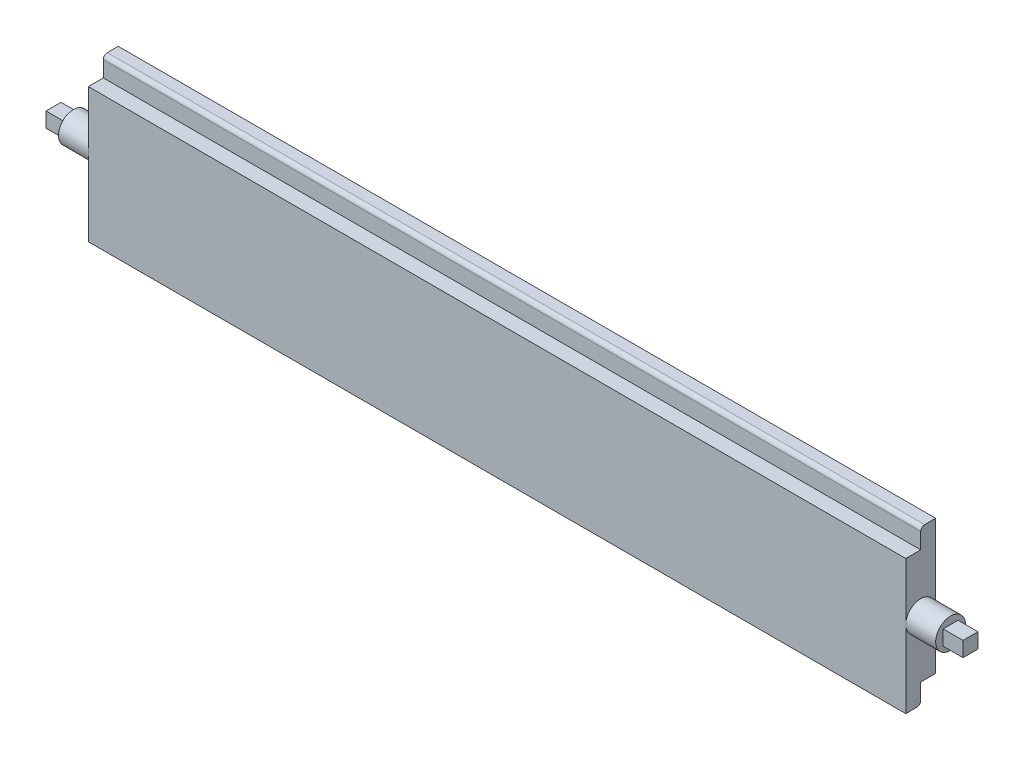
ISO-10303-21;
HEADER;
FILE_DESCRIPTION(('STEP AP214'),'2;1');
FILE_NAME('part.step','',(''),(''),'','','');
FILE_SCHEMA(('AUTOMOTIVE_DESIGN { 1 0 10303 214 1 1 1 1 }'));
ENDSEC;
DATA;
#1=APPLICATION_CONTEXT('core data for automotive mechanical design processes');
#2=APPLICATION_PROTOCOL_DEFINITION('international standard','automotive_design',2000,#1);
#3=PRODUCT_CONTEXT('',#1,'mechanical');
#4=PRODUCT('Part','Part','',(#3));
#5=PRODUCT_RELATED_PRODUCT_CATEGORY('part','',(#4));
#6=PRODUCT_DEFINITION_FORMATION('','',#4);
#7=PRODUCT_DEFINITION_CONTEXT('part definition',#1,'design');
#8=PRODUCT_DEFINITION('design','',#6,#7);
#9=PRODUCT_DEFINITION_SHAPE('','',#8);
#10=(LENGTH_UNIT() NAMED_UNIT(*) SI_UNIT(.MILLI.,.METRE.));
#11=(NAMED_UNIT(*) PLANE_ANGLE_UNIT() SI_UNIT($,.RADIAN.));
#12=(NAMED_UNIT(*) SI_UNIT($,.STERADIAN.) SOLID_ANGLE_UNIT());
#13=UNCERTAINTY_MEASURE_WITH_UNIT(LENGTH_MEASURE(1.E-05),#10,'distance_accuracy_value','');
#14=(GEOMETRIC_REPRESENTATION_CONTEXT(3) GLOBAL_UNCERTAINTY_ASSIGNED_CONTEXT((#13)) GLOBAL_UNIT_ASSIGNED_CONTEXT((#10,
#11,#12)) REPRESENTATION_CONTEXT('',''));
#15=CARTESIAN_POINT('',(0.,0.,0.));
#16=DIRECTION('',(0.,0.,1.));
#17=DIRECTION('',(1.,0.,0.));
#18=AXIS2_PLACEMENT_3D('',#15,#16,#17);
#19=CARTESIAN_POINT('',(-130.302,24.5999,4.7625));
#20=DIRECTION('',(0.,-1.,0.));
#21=DIRECTION('',(0.,0.,-1.));
#22=AXIS2_PLACEMENT_3D('',#19,#20,#21);
#23=PLANE('',#22);
#24=DIRECTION('',(0.,0.,-1.));
#25=VECTOR('',#24,1.);
#26=CARTESIAN_POINT('',(-130.302,24.5999,4.7625));
#27=LINE('',#26,#25);
#28=CARTESIAN_POINT('',(-130.302,24.5999,-1.27));
#29=VERTEX_POINT('',#28);
#30=CARTESIAN_POINT('',(-130.302,24.5999,-4.7625));
#31=VERTEX_POINT('',#30);
#32=EDGE_CURVE('E318',#29,#31,#27,.T.);
#33=ORIENTED_EDGE('',*,*,#32,.F.);
#34=DIRECTION('',(-1.,0.,0.));
#35=VECTOR('',#34,1.);
#36=CARTESIAN_POINT('',(130.302,24.5999,-1.27));
#37=LINE('',#36,#35);
#38=CARTESIAN_POINT('',(130.302,24.5999,-1.27));
#39=VERTEX_POINT('',#38);
#40=EDGE_CURVE('E43',#29,#39,#37,.F.);
#41=ORIENTED_EDGE('',*,*,#40,.T.);
#42=DIRECTION('',(0.,0.,-1.));
#43=VECTOR('',#42,1.);
#44=CARTESIAN_POINT('',(130.302,24.5999,4.7625));
#45=LINE('',#44,#43);
#46=CARTESIAN_POINT('',(130.302,24.5999,-4.7625));
#47=VERTEX_POINT('',#46);
#48=EDGE_CURVE('E320',#39,#47,#45,.T.);
#49=ORIENTED_EDGE('',*,*,#48,.T.);
#50=DIRECTION('',(-1.,0.,0.));
#51=VECTOR('',#50,1.);
#52=CARTESIAN_POINT('',(-130.302,24.5999,-4.7625));
#53=LINE('',#52,#51);
#54=EDGE_CURVE('E307',#47,#31,#53,.T.);
#55=ORIENTED_EDGE('',*,*,#54,.T.);
#56=EDGE_LOOP('',(#33,#41,#49,#55));
#57=FACE_BOUND('',#56,.T.);
#58=ADVANCED_FACE('F35',(#57),#23,.F.);
#59=CARTESIAN_POINT('',(-139.827,0.,0.));
#60=DIRECTION('',(-1.,0.,0.));
#61=DIRECTION('',(0.,0.,-1.));
#62=AXIS2_PLACEMENT_3D('',#59,#60,#61);
#63=PLANE('',#62);
#64=CARTESIAN_POINT('',(-139.827,0.,0.));
#65=DIRECTION('',(1.,0.,0.));
#66=DIRECTION('',(0.,0.,-1.));
#67=AXIS2_PLACEMENT_3D('',#64,#65,#66);
#68=CIRCLE('',#67,4.76249999999911);
#69=CARTESIAN_POINT('',(-139.827,0.,-4.76249999999911));
#70=VERTEX_POINT('',#69);
#71=EDGE_CURVE('E248',#70,#70,#68,.T.);
#72=ORIENTED_EDGE('',*,*,#71,.F.);
#73=EDGE_LOOP('',(#72));
#74=FACE_BOUND('',#73,.T.);
#75=DIRECTION('',(0.,0.,-1.));
#76=VECTOR('',#75,1.);
#77=CARTESIAN_POINT('',(-139.827,-2.3876,2.3876));
#78=LINE('',#77,#76);
#79=CARTESIAN_POINT('',(-139.827,-2.3876,2.3876));
#80=VERTEX_POINT('',#79);
#81=CARTESIAN_POINT('',(-139.827,-2.3876,-2.3876));
#82=VERTEX_POINT('',#81);
#83=EDGE_CURVE('E231',#80,#82,#78,.T.);
#84=ORIENTED_EDGE('',*,*,#83,.T.);
#85=DIRECTION('',(0.,1.,0.));
#86=VECTOR('',#85,1.);
#87=CARTESIAN_POINT('',(-139.827,-2.3876,-2.3876));
#88=LINE('',#87,#86);
#89=CARTESIAN_POINT('',(-139.827,2.3876,-2.3876));
#90=VERTEX_POINT('',#89);
#91=EDGE_CURVE('E213',#82,#90,#88,.T.);
#92=ORIENTED_EDGE('',*,*,#91,.T.);
#93=DIRECTION('',(0.,0.,1.));
#94=VECTOR('',#93,1.);
#95=CARTESIAN_POINT('',(-139.827,2.3876,2.3876));
#96=LINE('',#95,#94);
#97=CARTESIAN_POINT('',(-139.827,2.3876,2.3876));
#98=VERTEX_POINT('',#97);
#99=EDGE_CURVE('E219',#90,#98,#96,.T.);
#100=ORIENTED_EDGE('',*,*,#99,.T.);
#101=DIRECTION('',(0.,-1.,0.));
#102=VECTOR('',#101,1.);
#103=CARTESIAN_POINT('',(-139.827,-2.3876,2.3876));
#104=LINE('',#103,#102);
#105=EDGE_CURVE('E234',#98,#80,#104,.T.);
#106=ORIENTED_EDGE('',*,*,#105,.T.);
#107=EDGE_LOOP('',(#84,#92,#100,#106));
#108=FACE_BOUND('',#107,.T.);
#109=ADVANCED_FACE('F363',(#74,#108),#63,.T.);
#110=CARTESIAN_POINT('',(-130.302,-24.5999,4.7625));
#111=DIRECTION('',(1.,0.,0.));
#112=DIRECTION('',(0.,0.,-1.));
#113=AXIS2_PLACEMENT_3D('',#110,#111,#112);
#114=PLANE('',#113);
#115=DIRECTION('',(0.,-1.,0.));
#116=VECTOR('',#115,1.);
#117=CARTESIAN_POINT('',(-130.302,24.5999,0.));
#118=LINE('',#117,#116);
#119=CARTESIAN_POINT('',(-130.302,23.3299,0.));
#120=VERTEX_POINT('',#119);
#121=CARTESIAN_POINT('',(-130.302,18.2499,0.));
#122=VERTEX_POINT('',#121);
#123=EDGE_CURVE('E200',#120,#122,#118,.T.);
#124=ORIENTED_EDGE('',*,*,#123,.F.);
#125=CARTESIAN_POINT('',(-130.302,23.3299,-1.27));
#126=DIRECTION('',(1.,0.,0.));
#127=DIRECTION('',(0.,0.,-1.));
#128=AXIS2_PLACEMENT_3D('',#125,#126,#127);
#129=CIRCLE('',#128,1.27);
#130=EDGE_CURVE('E57',#120,#29,#129,.F.);
#131=ORIENTED_EDGE('',*,*,#130,.T.);
#132=ORIENTED_EDGE('',*,*,#32,.T.);
#133=DIRECTION('',(0.,-1.,0.));
#134=VECTOR('',#133,1.);
#135=CARTESIAN_POINT('',(-130.302,-24.5999,-4.7625));
#136=LINE('',#135,#134);
#137=CARTESIAN_POINT('',(-130.302,0.,-4.7625));
#138=VERTEX_POINT('',#137);
#139=EDGE_CURVE('E310',#31,#138,#136,.T.);
#140=ORIENTED_EDGE('',*,*,#139,.T.);
#141=CARTESIAN_POINT('',(-130.302,0.,0.));
#142=DIRECTION('',(1.,0.,0.));
#143=DIRECTION('',(0.,0.,-1.));
#144=AXIS2_PLACEMENT_3D('',#141,#142,#143);
#145=CIRCLE('',#144,4.76249999999911);
#146=CARTESIAN_POINT('',(-130.302,0.,4.76249999999911));
#147=VERTEX_POINT('',#146);
#148=EDGE_CURVE('E247',#138,#147,#145,.T.);
#149=ORIENTED_EDGE('',*,*,#148,.T.);
#150=DIRECTION('',(0.,-1.,0.));
#151=VECTOR('',#150,1.);
#152=CARTESIAN_POINT('',(-130.302,-24.5999,4.7625));
#153=LINE('',#152,#151);
#154=CARTESIAN_POINT('',(-130.302,18.2499,4.7625));
#155=VERTEX_POINT('',#154);
#156=EDGE_CURVE('E300',#155,#147,#153,.T.);
#157=ORIENTED_EDGE('',*,*,#156,.F.);
#158=DIRECTION('',(0.,0.,1.));
#159=VECTOR('',#158,1.);
#160=CARTESIAN_POINT('',(-130.302,18.2499,0.));
#161=LINE('',#160,#159);
#162=EDGE_CURVE('E208',#122,#155,#161,.T.);
#163=ORIENTED_EDGE('',*,*,#162,.F.);
#164=EDGE_LOOP('',(#124,#131,#132,#140,#149,#157,#163));
#165=FACE_BOUND('',#164,.T.);
#166=ADVANCED_FACE('F340',(#165),#114,.F.);
#167=CARTESIAN_POINT('',(130.302,-24.5999,4.7625));
#168=DIRECTION('',(-1.,0.,0.));
#169=DIRECTION('',(0.,0.,1.));
#170=AXIS2_PLACEMENT_3D('',#167,#168,#169);
#171=PLANE('',#170);
#172=ORIENTED_EDGE('',*,*,#48,.F.);
#173=CARTESIAN_POINT('',(130.302,23.3299,-1.27));
#174=DIRECTION('',(-1.,0.,0.));
#175=DIRECTION('',(0.,0.,1.));
#176=AXIS2_PLACEMENT_3D('',#173,#174,#175);
#177=CIRCLE('',#176,1.27);
#178=CARTESIAN_POINT('',(130.302,23.3299,0.));
#179=VERTEX_POINT('',#178);
#180=EDGE_CURVE('E11',#39,#179,#177,.F.);
#181=ORIENTED_EDGE('',*,*,#180,.T.);
#182=DIRECTION('',(0.,1.,0.));
#183=VECTOR('',#182,1.);
#184=CARTESIAN_POINT('',(130.302,24.5999,0.));
#185=LINE('',#184,#183);
#186=CARTESIAN_POINT('',(130.302,18.2499,0.));
#187=VERTEX_POINT('',#186);
#188=EDGE_CURVE('E205',#187,#179,#185,.T.);
#189=ORIENTED_EDGE('',*,*,#188,.F.);
#190=DIRECTION('',(0.,0.,1.));
#191=VECTOR('',#190,1.);
#192=CARTESIAN_POINT('',(130.302,18.2499,0.));
#193=LINE('',#192,#191);
#194=CARTESIAN_POINT('',(130.302,18.2499,4.7625));
#195=VERTEX_POINT('',#194);
#196=EDGE_CURVE('E210',#187,#195,#193,.T.);
#197=ORIENTED_EDGE('',*,*,#196,.T.);
#198=DIRECTION('',(0.,1.,0.));
#199=VECTOR('',#198,1.);
#200=CARTESIAN_POINT('',(130.302,-24.5999,4.7625));
#201=LINE('',#200,#199);
#202=CARTESIAN_POINT('',(130.302,0.,4.7625));
#203=VERTEX_POINT('',#202);
#204=EDGE_CURVE('E299',#203,#195,#201,.T.);
#205=ORIENTED_EDGE('',*,*,#204,.F.);
#206=CARTESIAN_POINT('',(130.302,0.,0.));
#207=DIRECTION('',(1.,0.,0.));
#208=DIRECTION('',(0.,0.,-1.));
#209=AXIS2_PLACEMENT_3D('',#206,#207,#208);
#210=CIRCLE('',#209,4.76249999999911);
#211=CARTESIAN_POINT('',(130.302,0.,-4.76249999999911));
#212=VERTEX_POINT('',#211);
#213=EDGE_CURVE('E287',#212,#203,#210,.T.);
#214=ORIENTED_EDGE('',*,*,#213,.F.);
#215=DIRECTION('',(0.,1.,0.));
#216=VECTOR('',#215,1.);
#217=CARTESIAN_POINT('',(130.302,-24.5999,-4.7625));
#218=LINE('',#217,#216);
#219=EDGE_CURVE('E291',#212,#47,#218,.T.);
#220=ORIENTED_EDGE('',*,*,#219,.T.);
#221=EDGE_LOOP('',(#172,#181,#189,#197,#205,#214,#220));
#222=FACE_BOUND('',#221,.T.);
#223=ADVANCED_FACE('F353',(#222),#171,.F.);
#224=DIRECTION('',(0.,0.,-1.));
#225=VECTOR('',#224,1.);
#226=CARTESIAN_POINT('',(130.302,-24.5999,4.7625));
#227=LINE('',#226,#225);
#228=CARTESIAN_POINT('',(130.302,-24.5999,4.7625));
#229=VERTEX_POINT('',#228);
#230=CARTESIAN_POINT('',(130.302,-24.5999,1.27));
#231=VERTEX_POINT('',#230);
#232=EDGE_CURVE('E304',#229,#231,#227,.T.);
#233=ORIENTED_EDGE('',*,*,#232,.T.);
#234=CARTESIAN_POINT('',(130.302,-23.3299,1.27));
#235=DIRECTION('',(-1.,0.,0.));
#236=DIRECTION('',(0.,0.,1.));
#237=AXIS2_PLACEMENT_3D('',#234,#235,#236);
#238=CIRCLE('',#237,1.27);
#239=CARTESIAN_POINT('',(130.302,-23.3299,0.));
#240=VERTEX_POINT('',#239);
#241=EDGE_CURVE('E327',#231,#240,#238,.F.);
#242=ORIENTED_EDGE('',*,*,#241,.T.);
#243=DIRECTION('',(0.,-1.,0.));
#244=VECTOR('',#243,1.);
#245=CARTESIAN_POINT('',(130.302,-24.5999,0.));
#246=LINE('',#245,#244);
#247=CARTESIAN_POINT('',(130.302,-18.2499,0.));
#248=VERTEX_POINT('',#247);
#249=EDGE_CURVE('E181',#248,#240,#246,.T.);
#250=ORIENTED_EDGE('',*,*,#249,.F.);
#251=DIRECTION('',(0.,0.,-1.));
#252=VECTOR('',#251,1.);
#253=CARTESIAN_POINT('',(130.302,-18.2499,0.));
#254=LINE('',#253,#252);
#255=CARTESIAN_POINT('',(130.302,-18.2499,-4.7625));
#256=VERTEX_POINT('',#255);
#257=EDGE_CURVE('E188',#248,#256,#254,.T.);
#258=ORIENTED_EDGE('',*,*,#257,.T.);
#259=EDGE_CURVE('E305',#256,#212,#218,.T.);
#260=ORIENTED_EDGE('',*,*,#259,.T.);
#261=EDGE_CURVE('E294',#203,#212,#210,.T.);
#262=ORIENTED_EDGE('',*,*,#261,.F.);
#263=EDGE_CURVE('E295',#229,#203,#201,.T.);
#264=ORIENTED_EDGE('',*,*,#263,.F.);
#265=EDGE_LOOP('',(#233,#242,#250,#258,#260,#262,#264));
#266=FACE_BOUND('',#265,.T.);
#267=ADVANCED_FACE('F373',(#266),#171,.F.);
#268=DIRECTION('',(0.,1.,0.));
#269=VECTOR('',#268,1.);
#270=CARTESIAN_POINT('',(-130.302,-24.5999,0.));
#271=LINE('',#270,#269);
#272=CARTESIAN_POINT('',(-130.302,-23.3299,0.));
#273=VERTEX_POINT('',#272);
#274=CARTESIAN_POINT('',(-130.302,-18.2499,0.));
#275=VERTEX_POINT('',#274);
#276=EDGE_CURVE('E171',#273,#275,#271,.T.);
#277=ORIENTED_EDGE('',*,*,#276,.F.);
#278=CARTESIAN_POINT('',(-130.302,-23.3299,1.27));
#279=DIRECTION('',(1.,0.,0.));
#280=DIRECTION('',(0.,0.,-1.));
#281=AXIS2_PLACEMENT_3D('',#278,#279,#280);
#282=CIRCLE('',#281,1.27);
#283=CARTESIAN_POINT('',(-130.302,-24.5999,1.27));
#284=VERTEX_POINT('',#283);
#285=EDGE_CURVE('E323',#273,#284,#282,.F.);
#286=ORIENTED_EDGE('',*,*,#285,.T.);
#287=DIRECTION('',(0.,0.,-1.));
#288=VECTOR('',#287,1.);
#289=CARTESIAN_POINT('',(-130.302,-24.5999,4.7625));
#290=LINE('',#289,#288);
#291=CARTESIAN_POINT('',(-130.302,-24.5999,4.7625));
#292=VERTEX_POINT('',#291);
#293=EDGE_CURVE('E315',#292,#284,#290,.T.);
#294=ORIENTED_EDGE('',*,*,#293,.F.);
#295=EDGE_CURVE('E298',#147,#292,#153,.T.);
#296=ORIENTED_EDGE('',*,*,#295,.F.);
#297=EDGE_CURVE('E254',#147,#138,#145,.T.);
#298=ORIENTED_EDGE('',*,*,#297,.T.);
#299=CARTESIAN_POINT('',(-130.302,-18.2499,-4.7625));
#300=VERTEX_POINT('',#299);
#301=EDGE_CURVE('E194',#138,#300,#136,.T.);
#302=ORIENTED_EDGE('',*,*,#301,.T.);
#303=DIRECTION('',(0.,0.,-1.));
#304=VECTOR('',#303,1.);
#305=CARTESIAN_POINT('',(-130.302,-18.2499,0.));
#306=LINE('',#305,#304);
#307=EDGE_CURVE('E185',#275,#300,#306,.T.);
#308=ORIENTED_EDGE('',*,*,#307,.F.);
#309=EDGE_LOOP('',(#277,#286,#294,#296,#298,#302,#308));
#310=FACE_BOUND('',#309,.T.);
#311=ADVANCED_FACE('F191',(#310),#114,.F.);
#312=CARTESIAN_POINT('',(-130.302,-24.5999,4.7625));
#313=DIRECTION('',(0.,1.,0.));
#314=DIRECTION('',(0.,0.,1.));
#315=AXIS2_PLACEMENT_3D('',#312,#313,#314);
#316=PLANE('',#315);
#317=ORIENTED_EDGE('',*,*,#293,.T.);
#318=DIRECTION('',(-1.,0.,0.));
#319=VECTOR('',#318,1.);
#320=CARTESIAN_POINT('',(-130.302,-24.5999,1.27));
#321=LINE('',#320,#319);
#322=EDGE_CURVE('E325',#284,#231,#321,.F.);
#323=ORIENTED_EDGE('',*,*,#322,.T.);
#324=ORIENTED_EDGE('',*,*,#232,.F.);
#325=DIRECTION('',(1.,0.,0.));
#326=VECTOR('',#325,1.);
#327=CARTESIAN_POINT('',(-130.302,-24.5999,4.7625));
#328=LINE('',#327,#326);
#329=EDGE_CURVE('E302',#292,#229,#328,.T.);
#330=ORIENTED_EDGE('',*,*,#329,.F.);
#331=EDGE_LOOP('',(#317,#323,#324,#330));
#332=FACE_BOUND('',#331,.T.);
#333=ADVANCED_FACE('F380',(#332),#316,.F.);
#334=CARTESIAN_POINT('',(0.,0.,4.7625));
#335=DIRECTION('',(0.,0.,-1.));
#336=DIRECTION('',(-1.,0.,0.));
#337=AXIS2_PLACEMENT_3D('',#334,#335,#336);
#338=PLANE('',#337);
#339=ORIENTED_EDGE('',*,*,#204,.T.);
#340=DIRECTION('',(1.,0.,0.));
#341=VECTOR('',#340,1.);
#342=CARTESIAN_POINT('',(-130.302,18.2499,4.7625));
#343=LINE('',#342,#341);
#344=EDGE_CURVE('E196',#155,#195,#343,.T.);
#345=ORIENTED_EDGE('',*,*,#344,.F.);
#346=ORIENTED_EDGE('',*,*,#156,.T.);
#347=ORIENTED_EDGE('',*,*,#295,.T.);
#348=ORIENTED_EDGE('',*,*,#329,.T.);
#349=ORIENTED_EDGE('',*,*,#263,.T.);
#350=EDGE_LOOP('',(#339,#345,#346,#347,#348,#349));
#351=FACE_BOUND('',#350,.T.);
#352=ADVANCED_FACE('F347',(#351),#338,.F.);
#353=CARTESIAN_POINT('',(0.,0.,-4.7625));
#354=DIRECTION('',(0.,0.,-1.));
#355=DIRECTION('',(-1.,0.,0.));
#356=AXIS2_PLACEMENT_3D('',#353,#354,#355);
#357=PLANE('',#356);
#358=DIRECTION('',(1.,0.,0.));
#359=VECTOR('',#358,1.);
#360=CARTESIAN_POINT('',(130.302,-18.2499,-4.7625));
#361=LINE('',#360,#359);
#362=EDGE_CURVE('E394',#300,#256,#361,.T.);
#363=ORIENTED_EDGE('',*,*,#362,.F.);
#364=ORIENTED_EDGE('',*,*,#301,.F.);
#365=ORIENTED_EDGE('',*,*,#139,.F.);
#366=ORIENTED_EDGE('',*,*,#54,.F.);
#367=ORIENTED_EDGE('',*,*,#219,.F.);
#368=ORIENTED_EDGE('',*,*,#259,.F.);
#369=EDGE_LOOP('',(#363,#364,#365,#366,#367,#368));
#370=FACE_BOUND('',#369,.T.);
#371=ADVANCED_FACE('F391',(#370),#357,.T.);
#372=CARTESIAN_POINT('',(139.827,0.,0.));
#373=DIRECTION('',(-1.,0.,0.));
#374=DIRECTION('',(0.,0.,1.));
#375=AXIS2_PLACEMENT_3D('',#372,#373,#374);
#376=CYLINDRICAL_SURFACE('',#375,4.76249999999911);
#377=CARTESIAN_POINT('',(139.827,0.,0.));
#378=DIRECTION('',(1.,0.,0.));
#379=DIRECTION('',(0.,0.,-1.));
#380=AXIS2_PLACEMENT_3D('',#377,#378,#379);
#381=CIRCLE('',#380,4.76249999999911);
#382=CARTESIAN_POINT('',(139.827,0.,-4.76249999999911));
#383=VERTEX_POINT('',#382);
#384=EDGE_CURVE('E288',#383,#383,#381,.T.);
#385=ORIENTED_EDGE('',*,*,#384,.F.);
#386=EDGE_LOOP('',(#385));
#387=FACE_BOUND('',#386,.T.);
#388=ORIENTED_EDGE('',*,*,#213,.T.);
#389=ORIENTED_EDGE('',*,*,#261,.T.);
#390=EDGE_LOOP('',(#388,#389));
#391=FACE_BOUND('',#390,.T.);
#392=ADVANCED_FACE('F398',(#387,#391),#376,.T.);
#393=CARTESIAN_POINT('',(139.827,0.,0.));
#394=DIRECTION('',(1.,0.,0.));
#395=DIRECTION('',(0.,0.,-1.));
#396=AXIS2_PLACEMENT_3D('',#393,#394,#395);
#397=PLANE('',#396);
#398=DIRECTION('',(0.,1.,0.));
#399=VECTOR('',#398,1.);
#400=CARTESIAN_POINT('',(139.827,-2.3876,-2.3876));
#401=LINE('',#400,#399);
#402=CARTESIAN_POINT('',(139.827,-2.3876,-2.3876));
#403=VERTEX_POINT('',#402);
#404=CARTESIAN_POINT('',(139.827,2.3876,-2.3876));
#405=VERTEX_POINT('',#404);
#406=EDGE_CURVE('E251',#403,#405,#401,.T.);
#407=ORIENTED_EDGE('',*,*,#406,.F.);
#408=DIRECTION('',(0.,0.,-1.));
#409=VECTOR('',#408,1.);
#410=CARTESIAN_POINT('',(139.827,-2.3876,2.3876));
#411=LINE('',#410,#409);
#412=CARTESIAN_POINT('',(139.827,-2.3876,2.3876));
#413=VERTEX_POINT('',#412);
#414=EDGE_CURVE('E259',#413,#403,#411,.T.);
#415=ORIENTED_EDGE('',*,*,#414,.F.);
#416=DIRECTION('',(0.,-1.,0.));
#417=VECTOR('',#416,1.);
#418=CARTESIAN_POINT('',(139.827,-2.3876,2.3876));
#419=LINE('',#418,#417);
#420=CARTESIAN_POINT('',(139.827,2.3876,2.3876));
#421=VERTEX_POINT('',#420);
#422=EDGE_CURVE('E271',#421,#413,#419,.T.);
#423=ORIENTED_EDGE('',*,*,#422,.F.);
#424=DIRECTION('',(0.,0.,1.));
#425=VECTOR('',#424,1.);
#426=CARTESIAN_POINT('',(139.827,2.3876,2.3876));
#427=LINE('',#426,#425);
#428=EDGE_CURVE('E268',#405,#421,#427,.T.);
#429=ORIENTED_EDGE('',*,*,#428,.F.);
#430=EDGE_LOOP('',(#407,#415,#423,#429));
#431=FACE_BOUND('',#430,.T.);
#432=ORIENTED_EDGE('',*,*,#384,.T.);
#433=EDGE_LOOP('',(#432));
#434=FACE_BOUND('',#433,.T.);
#435=ADVANCED_FACE('F400',(#431,#434),#397,.T.);
#436=CARTESIAN_POINT('',(146.177,-2.3876,-2.3876));
#437=DIRECTION('',(0.,0.,1.));
#438=DIRECTION('',(1.,0.,0.));
#439=AXIS2_PLACEMENT_3D('',#436,#437,#438);
#440=PLANE('',#439);
#441=ORIENTED_EDGE('',*,*,#406,.T.);
#442=DIRECTION('',(-1.,0.,0.));
#443=VECTOR('',#442,1.);
#444=CARTESIAN_POINT('',(146.177,2.3876,-2.3876));
#445=LINE('',#444,#443);
#446=CARTESIAN_POINT('',(146.177,2.3876,-2.3876));
#447=VERTEX_POINT('',#446);
#448=EDGE_CURVE('E284',#447,#405,#445,.T.);
#449=ORIENTED_EDGE('',*,*,#448,.F.);
#450=DIRECTION('',(0.,1.,0.));
#451=VECTOR('',#450,1.);
#452=CARTESIAN_POINT('',(146.177,-2.3876,-2.3876));
#453=LINE('',#452,#451);
#454=CARTESIAN_POINT('',(146.177,-2.3876,-2.3876));
#455=VERTEX_POINT('',#454);
#456=EDGE_CURVE('E255',#455,#447,#453,.T.);
#457=ORIENTED_EDGE('',*,*,#456,.F.);
#458=DIRECTION('',(-1.,0.,0.));
#459=VECTOR('',#458,1.);
#460=CARTESIAN_POINT('',(146.177,-2.3876,-2.3876));
#461=LINE('',#460,#459);
#462=EDGE_CURVE('E265',#455,#403,#461,.T.);
#463=ORIENTED_EDGE('',*,*,#462,.T.);
#464=EDGE_LOOP('',(#441,#449,#457,#463));
#465=FACE_BOUND('',#464,.T.);
#466=ADVANCED_FACE('F407',(#465),#440,.F.);
#467=CARTESIAN_POINT('',(146.177,2.3876,2.3876));
#468=DIRECTION('',(0.,-1.,0.));
#469=DIRECTION('',(0.,0.,-1.));
#470=AXIS2_PLACEMENT_3D('',#467,#468,#469);
#471=PLANE('',#470);
#472=ORIENTED_EDGE('',*,*,#428,.T.);
#473=DIRECTION('',(-1.,0.,0.));
#474=VECTOR('',#473,1.);
#475=CARTESIAN_POINT('',(146.177,2.3876,2.3876));
#476=LINE('',#475,#474);
#477=CARTESIAN_POINT('',(146.177,2.3876,2.3876));
#478=VERTEX_POINT('',#477);
#479=EDGE_CURVE('E281',#478,#421,#476,.T.);
#480=ORIENTED_EDGE('',*,*,#479,.F.);
#481=DIRECTION('',(0.,0.,1.));
#482=VECTOR('',#481,1.);
#483=CARTESIAN_POINT('',(146.177,2.3876,2.3876));
#484=LINE('',#483,#482);
#485=EDGE_CURVE('E258',#447,#478,#484,.T.);
#486=ORIENTED_EDGE('',*,*,#485,.F.);
#487=ORIENTED_EDGE('',*,*,#448,.T.);
#488=EDGE_LOOP('',(#472,#480,#486,#487));
#489=FACE_BOUND('',#488,.T.);
#490=ADVANCED_FACE('F497',(#489),#471,.F.);
#491=CARTESIAN_POINT('',(146.177,-2.3876,2.3876));
#492=DIRECTION('',(0.,0.,-1.));
#493=DIRECTION('',(-1.,0.,0.));
#494=AXIS2_PLACEMENT_3D('',#491,#492,#493);
#495=PLANE('',#494);
#496=ORIENTED_EDGE('',*,*,#422,.T.);
#497=DIRECTION('',(-1.,0.,0.));
#498=VECTOR('',#497,1.);
#499=CARTESIAN_POINT('',(146.177,-2.3876,2.3876));
#500=LINE('',#499,#498);
#501=CARTESIAN_POINT('',(146.177,-2.3876,2.3876));
#502=VERTEX_POINT('',#501);
#503=EDGE_CURVE('E278',#502,#413,#500,.T.);
#504=ORIENTED_EDGE('',*,*,#503,.F.);
#505=DIRECTION('',(0.,-1.,0.));
#506=VECTOR('',#505,1.);
#507=CARTESIAN_POINT('',(146.177,-2.3876,2.3876));
#508=LINE('',#507,#506);
#509=EDGE_CURVE('E261',#478,#502,#508,.T.);
#510=ORIENTED_EDGE('',*,*,#509,.F.);
#511=ORIENTED_EDGE('',*,*,#479,.T.);
#512=EDGE_LOOP('',(#496,#504,#510,#511));
#513=FACE_BOUND('',#512,.T.);
#514=ADVANCED_FACE('F505',(#513),#495,.F.);
#515=CARTESIAN_POINT('',(146.177,-2.3876,2.3876));
#516=DIRECTION('',(0.,1.,0.));
#517=DIRECTION('',(0.,0.,1.));
#518=AXIS2_PLACEMENT_3D('',#515,#516,#517);
#519=PLANE('',#518);
#520=ORIENTED_EDGE('',*,*,#414,.T.);
#521=ORIENTED_EDGE('',*,*,#462,.F.);
#522=DIRECTION('',(0.,0.,-1.));
#523=VECTOR('',#522,1.);
#524=CARTESIAN_POINT('',(146.177,-2.3876,2.3876));
#525=LINE('',#524,#523);
#526=EDGE_CURVE('E263',#502,#455,#525,.T.);
#527=ORIENTED_EDGE('',*,*,#526,.F.);
#528=ORIENTED_EDGE('',*,*,#503,.T.);
#529=EDGE_LOOP('',(#520,#521,#527,#528));
#530=FACE_BOUND('',#529,.T.);
#531=ADVANCED_FACE('F514',(#530),#519,.F.);
#532=CARTESIAN_POINT('',(146.177,0.,0.));
#533=DIRECTION('',(-1.,0.,0.));
#534=DIRECTION('',(0.,0.,1.));
#535=AXIS2_PLACEMENT_3D('',#532,#533,#534);
#536=PLANE('',#535);
#537=ORIENTED_EDGE('',*,*,#456,.T.);
#538=ORIENTED_EDGE('',*,*,#485,.T.);
#539=ORIENTED_EDGE('',*,*,#509,.T.);
#540=ORIENTED_EDGE('',*,*,#526,.T.);
#541=EDGE_LOOP('',(#537,#538,#539,#540));
#542=FACE_BOUND('',#541,.T.);
#543=ADVANCED_FACE('F522',(#542),#536,.F.);
#544=CARTESIAN_POINT('',(-139.827,0.,0.));
#545=DIRECTION('',(1.,0.,0.));
#546=DIRECTION('',(0.,0.,-1.));
#547=AXIS2_PLACEMENT_3D('',#544,#545,#546);
#548=CYLINDRICAL_SURFACE('',#547,4.76249999999911);
#549=ORIENTED_EDGE('',*,*,#71,.T.);
#550=EDGE_LOOP('',(#549));
#551=FACE_BOUND('',#550,.T.);
#552=ORIENTED_EDGE('',*,*,#148,.F.);
#553=ORIENTED_EDGE('',*,*,#297,.F.);
#554=EDGE_LOOP('',(#552,#553));
#555=FACE_BOUND('',#554,.T.);
#556=ADVANCED_FACE('F530',(#551,#555),#548,.T.);
#557=CARTESIAN_POINT('',(-146.177,-2.3876,-2.3876));
#558=DIRECTION('',(0.,0.,-1.));
#559=DIRECTION('',(-1.,0.,0.));
#560=AXIS2_PLACEMENT_3D('',#557,#558,#559);
#561=PLANE('',#560);
#562=ORIENTED_EDGE('',*,*,#91,.F.);
#563=DIRECTION('',(1.,0.,0.));
#564=VECTOR('',#563,1.);
#565=CARTESIAN_POINT('',(-146.177,-2.3876,-2.3876));
#566=LINE('',#565,#564);
#567=CARTESIAN_POINT('',(-146.177,-2.3876,-2.3876));
#568=VERTEX_POINT('',#567);
#569=EDGE_CURVE('E244',#568,#82,#566,.T.);
#570=ORIENTED_EDGE('',*,*,#569,.F.);
#571=DIRECTION('',(0.,1.,0.));
#572=VECTOR('',#571,1.);
#573=CARTESIAN_POINT('',(-146.177,-2.3876,-2.3876));
#574=LINE('',#573,#572);
#575=CARTESIAN_POINT('',(-146.177,2.3876,-2.3876));
#576=VERTEX_POINT('',#575);
#577=EDGE_CURVE('E215',#568,#576,#574,.T.);
#578=ORIENTED_EDGE('',*,*,#577,.T.);
#579=DIRECTION('',(1.,0.,0.));
#580=VECTOR('',#579,1.);
#581=CARTESIAN_POINT('',(-146.177,2.3876,-2.3876));
#582=LINE('',#581,#580);
#583=EDGE_CURVE('E228',#576,#90,#582,.T.);
#584=ORIENTED_EDGE('',*,*,#583,.T.);
#585=EDGE_LOOP('',(#562,#570,#578,#584));
#586=FACE_BOUND('',#585,.T.);
#587=ADVANCED_FACE('F546',(#586),#561,.T.);
#588=CARTESIAN_POINT('',(-146.177,-2.3876,2.3876));
#589=DIRECTION('',(0.,-1.,0.));
#590=DIRECTION('',(0.,0.,-1.));
#591=AXIS2_PLACEMENT_3D('',#588,#589,#590);
#592=PLANE('',#591);
#593=ORIENTED_EDGE('',*,*,#83,.F.);
#594=DIRECTION('',(1.,0.,0.));
#595=VECTOR('',#594,1.);
#596=CARTESIAN_POINT('',(-146.177,-2.3876,2.3876));
#597=LINE('',#596,#595);
#598=CARTESIAN_POINT('',(-146.177,-2.3876,2.3876));
#599=VERTEX_POINT('',#598);
#600=EDGE_CURVE('E242',#599,#80,#597,.T.);
#601=ORIENTED_EDGE('',*,*,#600,.F.);
#602=DIRECTION('',(0.,0.,-1.));
#603=VECTOR('',#602,1.);
#604=CARTESIAN_POINT('',(-146.177,-2.3876,2.3876));
#605=LINE('',#604,#603);
#606=EDGE_CURVE('E218',#599,#568,#605,.T.);
#607=ORIENTED_EDGE('',*,*,#606,.T.);
#608=ORIENTED_EDGE('',*,*,#569,.T.);
#609=EDGE_LOOP('',(#593,#601,#607,#608));
#610=FACE_BOUND('',#609,.T.);
#611=ADVANCED_FACE('F555',(#610),#592,.T.);
#612=CARTESIAN_POINT('',(-146.177,-2.3876,2.3876));
#613=DIRECTION('',(0.,0.,1.));
#614=DIRECTION('',(1.,0.,0.));
#615=AXIS2_PLACEMENT_3D('',#612,#613,#614);
#616=PLANE('',#615);
#617=ORIENTED_EDGE('',*,*,#105,.F.);
#618=DIRECTION('',(1.,0.,0.));
#619=VECTOR('',#618,1.);
#620=CARTESIAN_POINT('',(-146.177,2.3876,2.3876));
#621=LINE('',#620,#619);
#622=CARTESIAN_POINT('',(-146.177,2.3876,2.3876));
#623=VERTEX_POINT('',#622);
#624=EDGE_CURVE('E240',#623,#98,#621,.T.);
#625=ORIENTED_EDGE('',*,*,#624,.F.);
#626=DIRECTION('',(0.,-1.,0.));
#627=VECTOR('',#626,1.);
#628=CARTESIAN_POINT('',(-146.177,-2.3876,2.3876));
#629=LINE('',#628,#627);
#630=EDGE_CURVE('E222',#623,#599,#629,.T.);
#631=ORIENTED_EDGE('',*,*,#630,.T.);
#632=ORIENTED_EDGE('',*,*,#600,.T.);
#633=EDGE_LOOP('',(#617,#625,#631,#632));
#634=FACE_BOUND('',#633,.T.);
#635=ADVANCED_FACE('F565',(#634),#616,.T.);
#636=CARTESIAN_POINT('',(-146.177,2.3876,2.3876));
#637=DIRECTION('',(0.,1.,0.));
#638=DIRECTION('',(0.,0.,1.));
#639=AXIS2_PLACEMENT_3D('',#636,#637,#638);
#640=PLANE('',#639);
#641=ORIENTED_EDGE('',*,*,#99,.F.);
#642=ORIENTED_EDGE('',*,*,#583,.F.);
#643=DIRECTION('',(0.,0.,1.));
#644=VECTOR('',#643,1.);
#645=CARTESIAN_POINT('',(-146.177,2.3876,2.3876));
#646=LINE('',#645,#644);
#647=EDGE_CURVE('E225',#576,#623,#646,.T.);
#648=ORIENTED_EDGE('',*,*,#647,.T.);
#649=ORIENTED_EDGE('',*,*,#624,.T.);
#650=EDGE_LOOP('',(#641,#642,#648,#649));
#651=FACE_BOUND('',#650,.T.);
#652=ADVANCED_FACE('F575',(#651),#640,.T.);
#653=CARTESIAN_POINT('',(-146.177,0.,0.));
#654=DIRECTION('',(1.,0.,0.));
#655=DIRECTION('',(0.,0.,1.));
#656=AXIS2_PLACEMENT_3D('',#653,#654,#655);
#657=PLANE('',#656);
#658=ORIENTED_EDGE('',*,*,#577,.F.);
#659=ORIENTED_EDGE('',*,*,#606,.F.);
#660=ORIENTED_EDGE('',*,*,#630,.F.);
#661=ORIENTED_EDGE('',*,*,#647,.F.);
#662=EDGE_LOOP('',(#658,#659,#660,#661));
#663=FACE_BOUND('',#662,.T.);
#664=ADVANCED_FACE('F584',(#663),#657,.F.);
#665=CARTESIAN_POINT('',(-130.302,18.2499,0.));
#666=DIRECTION('',(0.,-1.,0.));
#667=DIRECTION('',(0.,0.,-1.));
#668=AXIS2_PLACEMENT_3D('',#665,#666,#667);
#669=PLANE('',#668);
#670=ORIENTED_EDGE('',*,*,#344,.T.);
#671=ORIENTED_EDGE('',*,*,#196,.F.);
#672=DIRECTION('',(1.,0.,0.));
#673=VECTOR('',#672,1.);
#674=CARTESIAN_POINT('',(-130.302,18.2499,0.));
#675=LINE('',#674,#673);
#676=EDGE_CURVE('E202',#122,#187,#675,.T.);
#677=ORIENTED_EDGE('',*,*,#676,.F.);
#678=ORIENTED_EDGE('',*,*,#162,.T.);
#679=EDGE_LOOP('',(#670,#671,#677,#678));
#680=FACE_BOUND('',#679,.T.);
#681=ADVANCED_FACE('F344',(#680),#669,.F.);
#682=CARTESIAN_POINT('',(0.,0.,0.));
#683=DIRECTION('',(0.,0.,1.));
#684=DIRECTION('',(1.,0.,0.));
#685=AXIS2_PLACEMENT_3D('',#682,#683,#684);
#686=PLANE('',#685);
#687=ORIENTED_EDGE('',*,*,#188,.T.);
#688=DIRECTION('',(-1.,0.,0.));
#689=VECTOR('',#688,1.);
#690=CARTESIAN_POINT('',(-130.302,23.3299,0.));
#691=LINE('',#690,#689);
#692=EDGE_CURVE('E329',#179,#120,#691,.T.);
#693=ORIENTED_EDGE('',*,*,#692,.T.);
#694=ORIENTED_EDGE('',*,*,#123,.T.);
#695=ORIENTED_EDGE('',*,*,#676,.T.);
#696=EDGE_LOOP('',(#687,#693,#694,#695));
#697=FACE_BOUND('',#696,.T.);
#698=ADVANCED_FACE('F334',(#697),#686,.T.);
#699=CARTESIAN_POINT('',(130.302,-18.2499,0.));
#700=DIRECTION('',(0.,1.,0.));
#701=DIRECTION('',(0.,0.,1.));
#702=AXIS2_PLACEMENT_3D('',#699,#700,#701);
#703=PLANE('',#702);
#704=ORIENTED_EDGE('',*,*,#362,.T.);
#705=ORIENTED_EDGE('',*,*,#257,.F.);
#706=DIRECTION('',(1.,0.,0.));
#707=VECTOR('',#706,1.);
#708=CARTESIAN_POINT('',(130.302,-18.2499,0.));
#709=LINE('',#708,#707);
#710=EDGE_CURVE('E175',#275,#248,#709,.T.);
#711=ORIENTED_EDGE('',*,*,#710,.F.);
#712=ORIENTED_EDGE('',*,*,#307,.T.);
#713=EDGE_LOOP('',(#704,#705,#711,#712));
#714=FACE_BOUND('',#713,.T.);
#715=ADVANCED_FACE('F184',(#714),#703,.F.);
#716=CARTESIAN_POINT('',(0.,0.,0.));
#717=DIRECTION('',(0.,0.,1.));
#718=DIRECTION('',(1.,0.,0.));
#719=AXIS2_PLACEMENT_3D('',#716,#717,#718);
#720=PLANE('',#719);
#721=ORIENTED_EDGE('',*,*,#249,.T.);
#722=DIRECTION('',(-1.,0.,0.));
#723=VECTOR('',#722,1.);
#724=CARTESIAN_POINT('',(0.,-23.3299,0.));
#725=LINE('',#724,#723);
#726=EDGE_CURVE('E178',#240,#273,#725,.T.);
#727=ORIENTED_EDGE('',*,*,#726,.T.);
#728=ORIENTED_EDGE('',*,*,#276,.T.);
#729=ORIENTED_EDGE('',*,*,#710,.T.);
#730=EDGE_LOOP('',(#721,#727,#728,#729));
#731=FACE_BOUND('',#730,.T.);
#732=ADVANCED_FACE('F174',(#731),#720,.F.);
#733=CARTESIAN_POINT('',(0.,-23.3299,1.27));
#734=DIRECTION('',(-1.,0.,0.));
#735=DIRECTION('',(0.,0.,1.));
#736=AXIS2_PLACEMENT_3D('',#733,#734,#735);
#737=CYLINDRICAL_SURFACE('',#736,1.27);
#738=ORIENTED_EDGE('',*,*,#241,.F.);
#739=ORIENTED_EDGE('',*,*,#322,.F.);
#740=ORIENTED_EDGE('',*,*,#285,.F.);
#741=ORIENTED_EDGE('',*,*,#726,.F.);
#742=EDGE_LOOP('',(#738,#739,#740,#741));
#743=FACE_BOUND('',#742,.T.);
#744=ADVANCED_FACE('F357',(#743),#737,.T.);
#745=CARTESIAN_POINT('',(0.,23.3299,-1.27));
#746=DIRECTION('',(1.,0.,0.));
#747=DIRECTION('',(0.,0.,-1.));
#748=AXIS2_PLACEMENT_3D('',#745,#746,#747);
#749=CYLINDRICAL_SURFACE('',#748,1.27);
#750=ORIENTED_EDGE('',*,*,#180,.F.);
#751=ORIENTED_EDGE('',*,*,#40,.F.);
#752=ORIENTED_EDGE('',*,*,#130,.F.);
#753=ORIENTED_EDGE('',*,*,#692,.F.);
#754=EDGE_LOOP('',(#750,#751,#752,#753));
#755=FACE_BOUND('',#754,.T.);
#756=ADVANCED_FACE('F37',(#755),#749,.T.);
#757=CLOSED_SHELL('',(#58,#109,#166,#223,#267,#311,#333,#352,#371,#392,#435,#466,#490,#514,#531,
#543,#556,#587,#611,#635,#652,#664,#681,#698,#715,#732,#744,#756));
#758=MANIFOLD_SOLID_BREP('B2',#757);
#759=ADVANCED_BREP_SHAPE_REPRESENTATION('',(#18,#758),#14);
#760=SHAPE_DEFINITION_REPRESENTATION(#9,#759);
ENDSEC;
END-ISO-10303-21;
